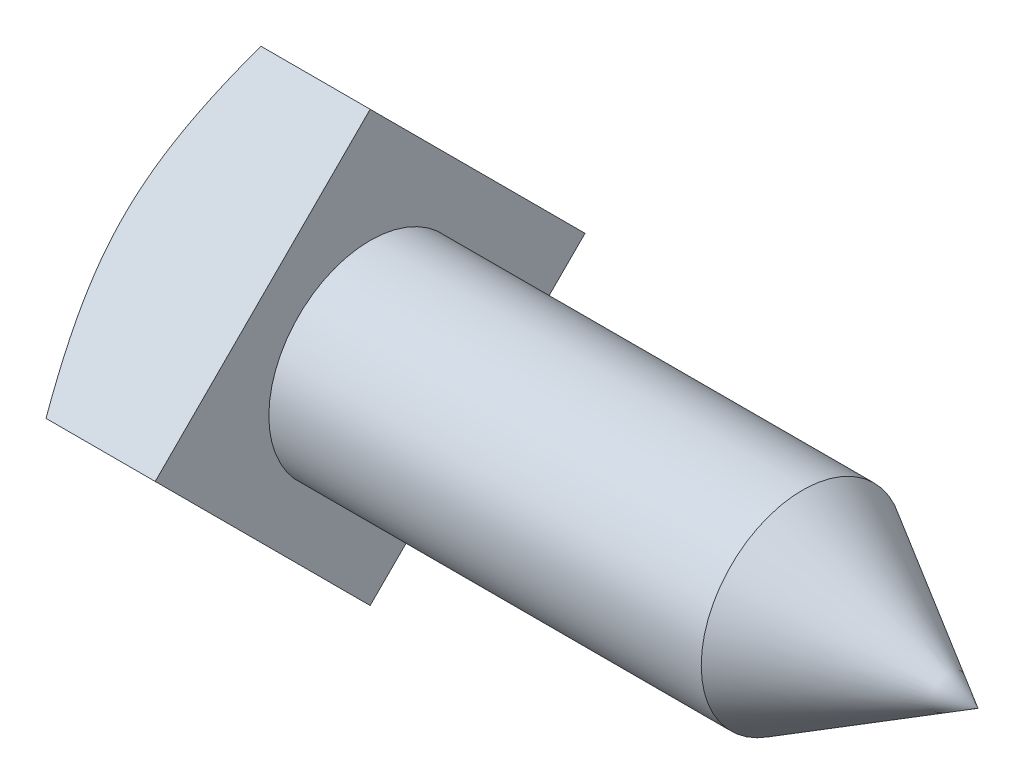
ISO-10303-21;
HEADER;
FILE_DESCRIPTION(('STEP AP214'),'2;1');
FILE_NAME('part.step','',(''),(''),'','','');
FILE_SCHEMA(('AUTOMOTIVE_DESIGN { 1 0 10303 214 1 1 1 1 }'));
ENDSEC;
DATA;
#1=APPLICATION_CONTEXT('core data for automotive mechanical design processes');
#2=APPLICATION_PROTOCOL_DEFINITION('international standard','automotive_design',2000,#1);
#3=PRODUCT_CONTEXT('',#1,'mechanical');
#4=PRODUCT('Part','Part','',(#3));
#5=PRODUCT_RELATED_PRODUCT_CATEGORY('part','',(#4));
#6=PRODUCT_DEFINITION_FORMATION('','',#4);
#7=PRODUCT_DEFINITION_CONTEXT('part definition',#1,'design');
#8=PRODUCT_DEFINITION('design','',#6,#7);
#9=PRODUCT_DEFINITION_SHAPE('','',#8);
#10=(LENGTH_UNIT() NAMED_UNIT(*) SI_UNIT(.MILLI.,.METRE.));
#11=(NAMED_UNIT(*) PLANE_ANGLE_UNIT() SI_UNIT($,.RADIAN.));
#12=(NAMED_UNIT(*) SI_UNIT($,.STERADIAN.) SOLID_ANGLE_UNIT());
#13=UNCERTAINTY_MEASURE_WITH_UNIT(LENGTH_MEASURE(1.E-05),#10,'distance_accuracy_value','');
#14=(GEOMETRIC_REPRESENTATION_CONTEXT(3) GLOBAL_UNCERTAINTY_ASSIGNED_CONTEXT((#13)) GLOBAL_UNIT_ASSIGNED_CONTEXT((#10,
#11,#12)) REPRESENTATION_CONTEXT('',''));
#15=CARTESIAN_POINT('',(0.,0.,0.));
#16=DIRECTION('',(0.,0.,1.));
#17=DIRECTION('',(1.,0.,0.));
#18=AXIS2_PLACEMENT_3D('',#15,#16,#17);
#19=CARTESIAN_POINT('',(17.3736,0.,-26.9407683632075));
#20=DIRECTION('',(0.,-0.707106781186549,0.707106781186546));
#21=DIRECTION('',(0.,-0.707106781186546,-0.707106781186549));
#22=AXIS2_PLACEMENT_3D('',#19,#20,#21);
#23=PLANE('',#22);
#24=CARTESIAN_POINT('',(3.67961897836863,26.9409683632075,0.000200000000045216));
#25=CARTESIAN_POINT('',(3.5548106744779,26.6733023350022,-0.267466028205203));
#26=CARTESIAN_POINT('',(3.43166591489863,26.4052457385589,-0.535522624648477));
#27=CARTESIAN_POINT('',(3.1890899267751,25.8682845755296,-1.0724837876778));
#28=CARTESIAN_POINT('',(3.06965881940346,25.5993799815889,-1.34138838161848));
#29=CARTESIAN_POINT('',(2.83485734138483,25.0605646045843,-1.88020375862312));
#30=CARTESIAN_POINT('',(2.71948863089288,24.7906534588859,-2.15011490432156));
#31=CARTESIAN_POINT('',(2.49331484279292,24.2498808259797,-2.69088753722775));
#32=CARTESIAN_POINT('',(2.38250972891658,23.9790193463431,-2.96174901686432));
#33=CARTESIAN_POINT('',(2.05612530796253,23.1610744333138,-3.77969392989365));
#34=CARTESIAN_POINT('',(1.84824930439006,22.6124346923039,-4.32833367090352));
#35=CARTESIAN_POINT('',(1.45758123264963,21.5107337556084,-5.430034607599));
#36=CARTESIAN_POINT('',(1.27478662714833,20.9576730131681,-5.9830953500393));
#37=CARTESIAN_POINT('',(0.945511734071481,19.8664326312515,-7.07433573195595));
#38=CARTESIAN_POINT('',(0.79798088957727,19.3284131944761,-7.61235516873135));
#39=CARTESIAN_POINT('',(0.536422228800219,18.2482773891681,-8.69249097403933));
#40=CARTESIAN_POINT('',(0.422394171895823,17.7061610500887,-9.23460731311871));
#41=CARTESIAN_POINT('',(0.233146716482555,16.6203771657464,-10.3203911974611));
#42=CARTESIAN_POINT('',(0.157794101744971,16.0767215200036,-10.8640468432038));
#43=CARTESIAN_POINT('',(0.0762638360765365,15.2597076194693,-11.6810607437382));
#44=CARTESIAN_POINT('',(0.0543365936512322,14.9871029257431,-11.9536654374643));
#45=CARTESIAN_POINT('',(0.0212582185382671,14.4415698757762,-12.4991984874312));
#46=CARTESIAN_POINT('',(0.0101066830280692,14.1686415320162,-12.7721268311912));
#47=CARTESIAN_POINT('',(-0.00161011344190508,13.605599139522,-13.3351692236855));
#48=CARTESIAN_POINT('',(-0.00146976557287539,13.3154776845977,-13.6252906786097));
#49=CARTESIAN_POINT('',(0.011159967421425,12.7353688974673,-14.2053994657402));
#50=CARTESIAN_POINT('',(0.0236494175099609,12.4453815659747,-14.4953867972328));
#51=CARTESIAN_POINT('',(0.0607802459783497,11.8657903885889,-15.0749779746185));
#52=CARTESIAN_POINT('',(0.0854218766143621,11.5761865507815,-15.364581812426));
#53=CARTESIAN_POINT('',(0.146470352139668,10.9975953278747,-15.9431730353328));
#54=CARTESIAN_POINT('',(0.182877743644435,10.7086079720439,-16.2321603911635));
#55=CARTESIAN_POINT('',(0.309293308607137,9.84074831588848,-17.100020047319));
#56=CARTESIAN_POINT('',(0.416353313854458,9.26308735289191,-17.6776810103156));
#57=CARTESIAN_POINT('',(0.670258795524519,8.11225138699092,-18.8285169762166));
#58=CARTESIAN_POINT('',(0.81710493512163,7.53907645902574,-19.4016919041817));
#59=CARTESIAN_POINT('',(1.15063001194142,6.37560138249195,-20.5651669807155));
#60=CARTESIAN_POINT('',(1.33862518399708,5.78549181858159,-21.1552765446259));
#61=CARTESIAN_POINT('',(1.74416737172929,4.61034109547358,-22.3304272677339));
#62=CARTESIAN_POINT('',(1.96171822054831,4.0253006041821,-22.9154677590254));
#63=CARTESIAN_POINT('',(2.30502412485186,3.15351567590044,-23.7872526873071));
#64=CARTESIAN_POINT('',(2.42180887555157,2.86498021977967,-24.0757881434278));
#65=CARTESIAN_POINT('',(2.66065189048929,2.28899759935433,-24.6517707638532));
#66=CARTESIAN_POINT('',(2.78271020630349,2.00155044572342,-24.9392179174841));
#67=CARTESIAN_POINT('',(3.03148171467405,1.42782962681058,-25.5129387363969));
#68=CARTESIAN_POINT('',(3.15819248210805,1.14155543424872,-25.7992129289588));
#69=CARTESIAN_POINT('',(3.41584794221307,0.569973412950501,-26.370794950257));
#70=CARTESIAN_POINT('',(3.54679246370201,0.284665545657028,-26.6561028175505));
#71=CARTESIAN_POINT('',(3.67961897836863,-0.000199999999958303,-26.9409683632075));
#72=B_SPLINE_CURVE_WITH_KNOTS('',3,(#24,#25,#26,#27,#28,#29,#30,#31,#32,#33,#34,#35,#36,#37,#38,
#39,#40,#41,#42,#43,#44,#45,#46,#47,#48,#49,#50,#51,#52,#53,#54,#55,#56,#57,#58,#59,#60,#61,#62,
#63,#64,#65,#66,#67,#68,#69,#70,#71),.UNSPECIFIED.,.F.,.F.,(4,2,2,2,2,2,2,2,2,2,2,2,2,2,2,2,2,2,
2,2,2,2,2,4),(0.,1.19574621782804,2.39153141076051,3.5877997366759,4.78405855363789,
7.1934730092088,9.60264353889679,11.9271362943406,14.2516123545547,16.5680271795087,
17.726333362957,18.8845962443842,20.1152898057051,21.3459898412049,22.5767154247725,
23.8074981937946,26.2780083205153,28.7485596294176,31.3142561631337,33.8802857660488,
35.1535601561366,36.4268470018451,37.6994793066262,38.9720602196475),.UNSPECIFIED.);
#73=CARTESIAN_POINT('',(3.67952571649083,26.9407683632075,0.));
#74=VERTEX_POINT('',#73);
#75=CARTESIAN_POINT('',(0.,13.4703841816038,-13.4703841816037));
#76=VERTEX_POINT('',#75);
#77=EDGE_CURVE('E104',#74,#76,#72,.T.);
#78=ORIENTED_EDGE('',*,*,#77,.F.);
#79=DIRECTION('',(-1.,0.,0.));
#80=VECTOR('',#79,1.);
#81=CARTESIAN_POINT('',(17.3736,26.9407683632075,0.));
#82=LINE('',#81,#80);
#83=CARTESIAN_POINT('',(17.3736,26.9407683632075,0.));
#84=VERTEX_POINT('',#83);
#85=EDGE_CURVE('E114',#84,#74,#82,.T.);
#86=ORIENTED_EDGE('',*,*,#85,.F.);
#87=DIRECTION('',(0.,0.707106781186546,0.707106781186549));
#88=VECTOR('',#87,1.);
#89=CARTESIAN_POINT('',(17.3736,0.,-26.9407683632075));
#90=LINE('',#89,#88);
#91=CARTESIAN_POINT('',(17.3736,0.,-26.9407683632075));
#92=VERTEX_POINT('',#91);
#93=EDGE_CURVE('E117',#92,#84,#90,.T.);
#94=ORIENTED_EDGE('',*,*,#93,.F.);
#95=DIRECTION('',(-1.,0.,0.));
#96=VECTOR('',#95,1.);
#97=CARTESIAN_POINT('',(17.3736,0.,-26.9407683632075));
#98=LINE('',#97,#96);
#99=CARTESIAN_POINT('',(3.67952571649083,0.,-26.9407683632075));
#100=VERTEX_POINT('',#99);
#101=EDGE_CURVE('E180',#92,#100,#98,.T.);
#102=ORIENTED_EDGE('',*,*,#101,.T.);
#103=EDGE_CURVE('E53',#76,#100,#72,.T.);
#104=ORIENTED_EDGE('',*,*,#103,.F.);
#105=EDGE_LOOP('',(#78,#86,#94,#102,#104));
#106=FACE_BOUND('',#105,.T.);
#107=ADVANCED_FACE('F32',(#106),#23,.F.);
#108=CARTESIAN_POINT('',(17.3736,0.,26.9407683632075));
#109=DIRECTION('',(0.,0.707106781186546,0.707106781186549));
#110=DIRECTION('',(0.,-0.707106781186549,0.707106781186546));
#111=AXIS2_PLACEMENT_3D('',#108,#109,#110);
#112=PLANE('',#111);
#113=ORIENTED_EDGE('',*,*,#85,.T.);
#114=CARTESIAN_POINT('',(3.67961897836863,26.9409683632075,-0.000199999999958046));
#115=CARTESIAN_POINT('',(3.5548106744779,26.6733023350022,0.267466028205296));
#116=CARTESIAN_POINT('',(3.43166591489863,26.4052457385589,0.535522624648567));
#117=CARTESIAN_POINT('',(3.1890899267751,25.8682845755296,1.07248378767788));
#118=CARTESIAN_POINT('',(3.06965881940345,25.5993799815889,1.34138838161855));
#119=CARTESIAN_POINT('',(2.83485734138483,25.0605646045843,1.8802037586232));
#120=CARTESIAN_POINT('',(2.71948863089288,24.7906534588859,2.15011490432164));
#121=CARTESIAN_POINT('',(2.49331484279293,24.2498808259797,2.69088753722783));
#122=CARTESIAN_POINT('',(2.38250972891658,23.9790193463431,2.9617490168644));
#123=CARTESIAN_POINT('',(2.05612530796252,23.1610744333138,3.77969392989372));
#124=CARTESIAN_POINT('',(1.84824930439005,22.6124346923039,4.3283336709036));
#125=CARTESIAN_POINT('',(1.45758123264963,21.5107337556084,5.43003460759907));
#126=CARTESIAN_POINT('',(1.27478662714833,20.9576730131681,5.98309535003937));
#127=CARTESIAN_POINT('',(0.945511734071483,19.8664326312515,7.07433573195601));
#128=CARTESIAN_POINT('',(0.797980889577271,19.3284131944761,7.61235516873141));
#129=CARTESIAN_POINT('',(0.536422228800219,18.2482773891681,8.69249097403939));
#130=CARTESIAN_POINT('',(0.422394171895823,17.7061610500887,9.23460731311877));
#131=CARTESIAN_POINT('',(0.233146716482557,16.6203771657463,10.3203911974611));
#132=CARTESIAN_POINT('',(0.157794101744973,16.0767215200036,10.8640468432039));
#133=CARTESIAN_POINT('',(0.0762638360765367,15.2597076194692,11.6810607437382));
#134=CARTESIAN_POINT('',(0.0543365936512313,14.9871029257431,11.9536654374644));
#135=CARTESIAN_POINT('',(0.0212582185382664,14.4415698757762,12.4991984874313));
#136=CARTESIAN_POINT('',(0.0101066830280697,14.1686415320162,12.7721268311913));
#137=CARTESIAN_POINT('',(-0.00161011344190393,13.6055991395219,13.3351692236856));
#138=CARTESIAN_POINT('',(-0.00146976557287488,13.3154776845977,13.6252906786098));
#139=CARTESIAN_POINT('',(0.0111599674214245,12.7353688974672,14.2053994657402));
#140=CARTESIAN_POINT('',(0.02364941750996,12.4453815659746,14.4953867972328));
#141=CARTESIAN_POINT('',(0.0607802459783491,11.8657903885889,15.0749779746186));
#142=CARTESIAN_POINT('',(0.0854218766143621,11.5761865507815,15.364581812426));
#143=CARTESIAN_POINT('',(0.146470352139668,10.9975953278746,15.9431730353328));
#144=CARTESIAN_POINT('',(0.182877743644435,10.7086079720439,16.2321603911636));
#145=CARTESIAN_POINT('',(0.309293308607135,9.84074831588842,17.100020047319));
#146=CARTESIAN_POINT('',(0.416353313854456,9.26308735289185,17.6776810103156));
#147=CARTESIAN_POINT('',(0.670258795524518,8.11225138699086,18.8285169762166));
#148=CARTESIAN_POINT('',(0.81710493512163,7.53907645902568,19.4016919041818));
#149=CARTESIAN_POINT('',(1.15063001194141,6.37560138249188,20.5651669807155));
#150=CARTESIAN_POINT('',(1.33862518399708,5.78549181858152,21.1552765446259));
#151=CARTESIAN_POINT('',(1.74416737172928,4.61034109547351,22.3304272677339));
#152=CARTESIAN_POINT('',(1.96171822054831,4.02530060418203,22.9154677590254));
#153=CARTESIAN_POINT('',(2.30502412485186,3.15351567590037,23.7872526873071));
#154=CARTESIAN_POINT('',(2.42180887555157,2.86498021977959,24.0757881434278));
#155=CARTESIAN_POINT('',(2.66065189048929,2.28899759935425,24.6517707638532));
#156=CARTESIAN_POINT('',(2.78271020630349,2.00155044572334,24.9392179174841));
#157=CARTESIAN_POINT('',(3.03148171467405,1.42782962681049,25.5129387363969));
#158=CARTESIAN_POINT('',(3.15819248210805,1.14155543424863,25.7992129289588));
#159=CARTESIAN_POINT('',(3.41584794221307,0.569973412950413,26.370794950257));
#160=CARTESIAN_POINT('',(3.54679246370201,0.284665545656939,26.6561028175505));
#161=CARTESIAN_POINT('',(3.67961897836863,-0.0002000000000479,26.9409683632075));
#162=B_SPLINE_CURVE_WITH_KNOTS('',3,(#114,#115,#116,#117,#118,#119,#120,#121,#122,#123,#124,
#125,#126,#127,#128,#129,#130,#131,#132,#133,#134,#135,#136,#137,#138,#139,#140,#141,#142,#143,
#144,#145,#146,#147,#148,#149,#150,#151,#152,#153,#154,#155,#156,#157,#158,#159,#160,#161),
.UNSPECIFIED.,.F.,.F.,(4,2,2,2,2,2,2,2,2,2,2,2,2,2,2,2,2,2,2,2,2,2,2,4),(0.,1.19574621782803,
2.39153141076051,3.5877997366759,4.78405855363789,7.1934730092088,9.60264353889679,
11.9271362943406,14.2516123545547,16.5680271795087,17.726333362957,18.8845962443842,
20.1152898057051,21.3459898412049,22.5767154247725,23.8074981937946,26.2780083205153,
28.7485596294176,31.3142561631337,33.8802857660488,35.1535601561366,36.4268470018451,
37.6994793066262,38.9720602196475),.UNSPECIFIED.);
#163=CARTESIAN_POINT('',(0.,13.4703841816037,13.4703841816038));
#164=VERTEX_POINT('',#163);
#165=EDGE_CURVE('E97',#74,#164,#162,.T.);
#166=ORIENTED_EDGE('',*,*,#165,.T.);
#167=CARTESIAN_POINT('',(3.67952571649083,0.,26.9407683632075));
#168=VERTEX_POINT('',#167);
#169=EDGE_CURVE('E88',#164,#168,#162,.T.);
#170=ORIENTED_EDGE('',*,*,#169,.T.);
#171=DIRECTION('',(-1.,0.,0.));
#172=VECTOR('',#171,1.);
#173=CARTESIAN_POINT('',(17.3736,0.,26.9407683632075));
#174=LINE('',#173,#172);
#175=CARTESIAN_POINT('',(17.3736,0.,26.9407683632075));
#176=VERTEX_POINT('',#175);
#177=EDGE_CURVE('E187',#176,#168,#174,.T.);
#178=ORIENTED_EDGE('',*,*,#177,.F.);
#179=DIRECTION('',(0.,0.707106781186549,-0.707106781186546));
#180=VECTOR('',#179,1.);
#181=CARTESIAN_POINT('',(17.3736,0.,26.9407683632075));
#182=LINE('',#181,#180);
#183=EDGE_CURVE('E202',#176,#84,#182,.T.);
#184=ORIENTED_EDGE('',*,*,#183,.T.);
#185=EDGE_LOOP('',(#113,#166,#170,#178,#184));
#186=FACE_BOUND('',#185,.T.);
#187=ADVANCED_FACE('F111',(#186),#112,.T.);
#188=CARTESIAN_POINT('',(17.3736,0.,26.9407683632075));
#189=DIRECTION('',(0.,0.707106781186549,-0.707106781186546));
#190=DIRECTION('',(0.,0.707106781186546,0.707106781186549));
#191=AXIS2_PLACEMENT_3D('',#188,#189,#190);
#192=PLANE('',#191);
#193=CARTESIAN_POINT('',(3.67961897836863,-26.9409683632075,-0.000200000000037707));
#194=CARTESIAN_POINT('',(3.5548106744779,-26.6733023350022,0.267466028205212));
#195=CARTESIAN_POINT('',(3.43166591489863,-26.4052457385589,0.535522624648485));
#196=CARTESIAN_POINT('',(3.1890899267751,-25.8682845755296,1.07248378767781));
#197=CARTESIAN_POINT('',(3.06965881940346,-25.5993799815889,1.34138838161848));
#198=CARTESIAN_POINT('',(2.83485734138483,-25.0605646045843,1.88020375862312));
#199=CARTESIAN_POINT('',(2.71948863089288,-24.7906534588859,2.15011490432156));
#200=CARTESIAN_POINT('',(2.49331484279292,-24.2498808259797,2.69088753722775));
#201=CARTESIAN_POINT('',(2.38250972891658,-23.9790193463431,2.96174901686433));
#202=CARTESIAN_POINT('',(2.05612530796253,-23.1610744333138,3.77969392989365));
#203=CARTESIAN_POINT('',(1.84824930439006,-22.6124346923039,4.32833367090353));
#204=CARTESIAN_POINT('',(1.45758123264964,-21.5107337556084,5.430034607599));
#205=CARTESIAN_POINT('',(1.27478662714834,-20.9576730131681,5.98309535003931));
#206=CARTESIAN_POINT('',(0.945511734071484,-19.8664326312515,7.07433573195595));
#207=CARTESIAN_POINT('',(0.797980889577274,-19.3284131944761,7.61235516873135));
#208=CARTESIAN_POINT('',(0.536422228800222,-18.2482773891681,8.69249097403933));
#209=CARTESIAN_POINT('',(0.422394171895826,-17.7061610500887,9.23460731311871));
#210=CARTESIAN_POINT('',(0.233146716482558,-16.6203771657464,10.3203911974611));
#211=CARTESIAN_POINT('',(0.157794101744974,-16.0767215200036,10.8640468432038));
#212=CARTESIAN_POINT('',(0.0762638360765389,-15.2597076194693,11.6810607437382));
#213=CARTESIAN_POINT('',(0.0543365936512346,-14.9871029257431,11.9536654374643));
#214=CARTESIAN_POINT('',(0.0212582185382695,-14.4415698757762,12.4991984874312));
#215=CARTESIAN_POINT('',(0.0101066830280716,-14.1686415320162,12.7721268311912));
#216=CARTESIAN_POINT('',(-0.0016101134419026,-13.605599139522,13.3351692236855));
#217=CARTESIAN_POINT('',(-0.00146976557287277,-13.3154776845977,13.6252906786097));
#218=CARTESIAN_POINT('',(0.0111599674214272,-12.7353688974673,14.2053994657402));
#219=CARTESIAN_POINT('',(0.0236494175099626,-12.4453815659747,14.4953867972328));
#220=CARTESIAN_POINT('',(0.0607802459783512,-11.8657903885889,15.0749779746185));
#221=CARTESIAN_POINT('',(0.0854218766143637,-11.5761865507815,15.364581812426));
#222=CARTESIAN_POINT('',(0.146470352139669,-10.9975953278747,15.9431730353328));
#223=CARTESIAN_POINT('',(0.182877743644437,-10.7086079720439,16.2321603911635));
#224=CARTESIAN_POINT('',(0.309293308607138,-9.84074831588848,17.100020047319));
#225=CARTESIAN_POINT('',(0.416353313854458,-9.26308735289192,17.6776810103156));
#226=CARTESIAN_POINT('',(0.670258795524519,-8.11225138699093,18.8285169762166));
#227=CARTESIAN_POINT('',(0.817104935121631,-7.53907645902575,19.4016919041817));
#228=CARTESIAN_POINT('',(1.15063001194142,-6.37560138249196,20.5651669807155));
#229=CARTESIAN_POINT('',(1.33862518399708,-5.7854918185816,21.1552765446259));
#230=CARTESIAN_POINT('',(1.74416737172929,-4.61034109547359,22.3304272677339));
#231=CARTESIAN_POINT('',(1.96171822054831,-4.02530060418211,22.9154677590254));
#232=CARTESIAN_POINT('',(2.30502412485186,-3.15351567590045,23.787252687307));
#233=CARTESIAN_POINT('',(2.42180887555157,-2.86498021977968,24.0757881434278));
#234=CARTESIAN_POINT('',(2.66065189048929,-2.28899759935433,24.6517707638532));
#235=CARTESIAN_POINT('',(2.78271020630349,-2.00155044572343,24.9392179174841));
#236=CARTESIAN_POINT('',(3.03148171467405,-1.42782962681058,25.5129387363969));
#237=CARTESIAN_POINT('',(3.15819248210805,-1.14155543424872,25.7992129289588));
#238=CARTESIAN_POINT('',(3.41584794221307,-0.569973412950508,26.370794950257));
#239=CARTESIAN_POINT('',(3.54679246370201,-0.284665545657037,26.6561028175505));
#240=CARTESIAN_POINT('',(3.67961897836863,0.000199999999947534,26.9409683632075));
#241=B_SPLINE_CURVE_WITH_KNOTS('',3,(#193,#194,#195,#196,#197,#198,#199,#200,#201,#202,#203,
#204,#205,#206,#207,#208,#209,#210,#211,#212,#213,#214,#215,#216,#217,#218,#219,#220,#221,#222,
#223,#224,#225,#226,#227,#228,#229,#230,#231,#232,#233,#234,#235,#236,#237,#238,#239,#240),
.UNSPECIFIED.,.F.,.F.,(4,2,2,2,2,2,2,2,2,2,2,2,2,2,2,2,2,2,2,2,2,2,2,4),(0.,1.19574621782803,
2.39153141076051,3.5877997366759,4.78405855363788,7.1934730092088,9.60264353889679,
11.9271362943406,14.2516123545547,16.5680271795087,17.726333362957,18.8845962443842,
20.1152898057051,21.3459898412049,22.5767154247725,23.8074981937946,26.2780083205153,
28.7485596294175,31.3142561631337,33.8802857660488,35.1535601561366,36.4268470018451,
37.6994793066262,38.9720602196474),.UNSPECIFIED.);
#242=CARTESIAN_POINT('',(3.67952571649083,-26.9407683632075,0.));
#243=VERTEX_POINT('',#242);
#244=CARTESIAN_POINT('',(0.,-13.4703841816038,13.4703841816037));
#245=VERTEX_POINT('',#244);
#246=EDGE_CURVE('E145',#243,#245,#241,.T.);
#247=ORIENTED_EDGE('',*,*,#246,.F.);
#248=DIRECTION('',(-1.,0.,0.));
#249=VECTOR('',#248,1.);
#250=CARTESIAN_POINT('',(17.3736,-26.9407683632075,0.));
#251=LINE('',#250,#249);
#252=CARTESIAN_POINT('',(17.3736,-26.9407683632075,0.));
#253=VERTEX_POINT('',#252);
#254=EDGE_CURVE('E183',#253,#243,#251,.T.);
#255=ORIENTED_EDGE('',*,*,#254,.F.);
#256=DIRECTION('',(0.,-0.707106781186546,-0.707106781186549));
#257=VECTOR('',#256,1.);
#258=CARTESIAN_POINT('',(17.3736,0.,26.9407683632075));
#259=LINE('',#258,#257);
#260=EDGE_CURVE('E189',#176,#253,#259,.T.);
#261=ORIENTED_EDGE('',*,*,#260,.F.);
#262=ORIENTED_EDGE('',*,*,#177,.T.);
#263=EDGE_CURVE('E93',#245,#168,#241,.T.);
#264=ORIENTED_EDGE('',*,*,#263,.F.);
#265=EDGE_LOOP('',(#247,#255,#261,#262,#264));
#266=FACE_BOUND('',#265,.T.);
#267=ADVANCED_FACE('F150',(#266),#192,.F.);
#268=CARTESIAN_POINT('',(17.3736,0.,-26.9407683632075));
#269=DIRECTION('',(0.,-0.707106781186546,-0.707106781186549));
#270=DIRECTION('',(0.,0.707106781186549,-0.707106781186546));
#271=AXIS2_PLACEMENT_3D('',#268,#269,#270);
#272=PLANE('',#271);
#273=ORIENTED_EDGE('',*,*,#254,.T.);
#274=CARTESIAN_POINT('',(3.67961897836863,-26.9409683632075,0.000199999999957179));
#275=CARTESIAN_POINT('',(3.5548106744779,-26.6733023350022,-0.267466028205298));
#276=CARTESIAN_POINT('',(3.43166591489863,-26.4052457385589,-0.535522624648569));
#277=CARTESIAN_POINT('',(3.1890899267751,-25.8682845755296,-1.07248378767788));
#278=CARTESIAN_POINT('',(3.06965881940346,-25.5993799815889,-1.34138838161855));
#279=CARTESIAN_POINT('',(2.83485734138483,-25.0605646045843,-1.8802037586232));
#280=CARTESIAN_POINT('',(2.71948863089288,-24.7906534588859,-2.15011490432164));
#281=CARTESIAN_POINT('',(2.49331484279293,-24.2498808259797,-2.69088753722783));
#282=CARTESIAN_POINT('',(2.38250972891658,-23.9790193463431,-2.9617490168644));
#283=CARTESIAN_POINT('',(2.05612530796253,-23.1610744333138,-3.77969392989372));
#284=CARTESIAN_POINT('',(1.84824930439006,-22.6124346923039,-4.32833367090359));
#285=CARTESIAN_POINT('',(1.45758123264964,-21.5107337556084,-5.43003460759906));
#286=CARTESIAN_POINT('',(1.27478662714834,-20.9576730131681,-5.98309535003937));
#287=CARTESIAN_POINT('',(0.945511734071483,-19.8664326312515,-7.07433573195601));
#288=CARTESIAN_POINT('',(0.797980889577275,-19.3284131944761,-7.61235516873141));
#289=CARTESIAN_POINT('',(0.536422228800223,-18.2482773891681,-8.69249097403939));
#290=CARTESIAN_POINT('',(0.422394171895824,-17.7061610500887,-9.23460731311877));
#291=CARTESIAN_POINT('',(0.233146716482556,-16.6203771657463,-10.3203911974611));
#292=CARTESIAN_POINT('',(0.157794101744973,-16.0767215200036,-10.8640468432039));
#293=CARTESIAN_POINT('',(0.076263836076538,-15.2597076194692,-11.6810607437382));
#294=CARTESIAN_POINT('',(0.054336593651233,-14.9871029257431,-11.9536654374644));
#295=CARTESIAN_POINT('',(0.0212582185382679,-14.4415698757762,-12.4991984874313));
#296=CARTESIAN_POINT('',(0.0101066830280708,-14.1686415320162,-12.7721268311913));
#297=CARTESIAN_POINT('',(-0.00161011344190344,-13.6055991395219,-13.3351692236855));
#298=CARTESIAN_POINT('',(-0.00146976557287458,-13.3154776845977,-13.6252906786098));
#299=CARTESIAN_POINT('',(0.0111599674214242,-12.7353688974672,-14.2053994657402));
#300=CARTESIAN_POINT('',(0.0236494175099593,-12.4453815659746,-14.4953867972328));
#301=CARTESIAN_POINT('',(0.0607802459783481,-11.8657903885889,-15.0749779746186));
#302=CARTESIAN_POINT('',(0.0854218766143613,-11.5761865507815,-15.364581812426));
#303=CARTESIAN_POINT('',(0.146470352139667,-10.9975953278747,-15.9431730353328));
#304=CARTESIAN_POINT('',(0.182877743644434,-10.7086079720439,-16.2321603911636));
#305=CARTESIAN_POINT('',(0.309293308607134,-9.84074831588843,-17.100020047319));
#306=CARTESIAN_POINT('',(0.416353313854455,-9.26308735289186,-17.6776810103156));
#307=CARTESIAN_POINT('',(0.670258795524518,-8.11225138699086,-18.8285169762166));
#308=CARTESIAN_POINT('',(0.81710493512163,-7.53907645902569,-19.4016919041818));
#309=CARTESIAN_POINT('',(1.15063001194142,-6.37560138249189,-20.5651669807155));
#310=CARTESIAN_POINT('',(1.33862518399708,-5.78549181858152,-21.1552765446259));
#311=CARTESIAN_POINT('',(1.74416737172929,-4.61034109547351,-22.3304272677339));
#312=CARTESIAN_POINT('',(1.96171822054831,-4.02530060418203,-22.9154677590254));
#313=CARTESIAN_POINT('',(2.30502412485186,-3.15351567590037,-23.7872526873071));
#314=CARTESIAN_POINT('',(2.42180887555157,-2.86498021977959,-24.0757881434278));
#315=CARTESIAN_POINT('',(2.66065189048929,-2.28899759935425,-24.6517707638532));
#316=CARTESIAN_POINT('',(2.78271020630349,-2.00155044572334,-24.9392179174841));
#317=CARTESIAN_POINT('',(3.03148171467406,-1.42782962681049,-25.5129387363969));
#318=CARTESIAN_POINT('',(3.15819248210805,-1.14155543424863,-25.7992129289588));
#319=CARTESIAN_POINT('',(3.41584794221307,-0.569973412950415,-26.370794950257));
#320=CARTESIAN_POINT('',(3.54679246370201,-0.284665545656943,-26.6561028175505));
#321=CARTESIAN_POINT('',(3.67961897836863,0.00020000000004155,-26.9409683632075));
#322=B_SPLINE_CURVE_WITH_KNOTS('',3,(#274,#275,#276,#277,#278,#279,#280,#281,#282,#283,#284,
#285,#286,#287,#288,#289,#290,#291,#292,#293,#294,#295,#296,#297,#298,#299,#300,#301,#302,#303,
#304,#305,#306,#307,#308,#309,#310,#311,#312,#313,#314,#315,#316,#317,#318,#319,#320,#321),
.UNSPECIFIED.,.F.,.F.,(4,2,2,2,2,2,2,2,2,2,2,2,2,2,2,2,2,2,2,2,2,2,2,4),(0.,1.19574621782803,
2.39153141076051,3.58779973667589,4.78405855363788,7.19347300920879,9.60264353889679,
11.9271362943406,14.2516123545547,16.5680271795087,17.726333362957,18.8845962443842,
20.1152898057051,21.3459898412049,22.5767154247725,23.8074981937946,26.2780083205153,
28.7485596294176,31.3142561631337,33.8802857660488,35.1535601561366,36.4268470018451,
37.6994793066262,38.9720602196475),.UNSPECIFIED.);
#323=CARTESIAN_POINT('',(0.,-13.4703841816037,-13.4703841816038));
#324=VERTEX_POINT('',#323);
#325=EDGE_CURVE('E149',#243,#324,#322,.T.);
#326=ORIENTED_EDGE('',*,*,#325,.T.);
#327=EDGE_CURVE('E107',#324,#100,#322,.T.);
#328=ORIENTED_EDGE('',*,*,#327,.T.);
#329=ORIENTED_EDGE('',*,*,#101,.F.);
#330=DIRECTION('',(0.,-0.707106781186549,0.707106781186547));
#331=VECTOR('',#330,1.);
#332=CARTESIAN_POINT('',(17.3736,0.,-26.9407683632075));
#333=LINE('',#332,#331);
#334=EDGE_CURVE('E184',#92,#253,#333,.T.);
#335=ORIENTED_EDGE('',*,*,#334,.T.);
#336=EDGE_LOOP('',(#273,#326,#328,#329,#335));
#337=FACE_BOUND('',#336,.T.);
#338=ADVANCED_FACE('F153',(#337),#272,.T.);
#339=CARTESIAN_POINT('',(17.3736,0.,-26.9407683632075));
#340=DIRECTION('',(1.,0.,0.));
#341=DIRECTION('',(0.,0.,-1.));
#342=AXIS2_PLACEMENT_3D('',#339,#340,#341);
#343=PLANE('',#342);
#344=CARTESIAN_POINT('',(17.3736,0.,0.));
#345=DIRECTION('',(1.,0.,0.));
#346=DIRECTION('',(0.,0.,-1.));
#347=AXIS2_PLACEMENT_3D('',#344,#345,#346);
#348=CIRCLE('',#347,12.7);
#349=CARTESIAN_POINT('',(17.3736,0.,-12.7));
#350=VERTEX_POINT('',#349);
#351=EDGE_CURVE('E194',#350,#350,#348,.T.);
#352=ORIENTED_EDGE('',*,*,#351,.F.);
#353=EDGE_LOOP('',(#352));
#354=FACE_BOUND('',#353,.T.);
#355=ORIENTED_EDGE('',*,*,#93,.T.);
#356=ORIENTED_EDGE('',*,*,#183,.F.);
#357=ORIENTED_EDGE('',*,*,#260,.T.);
#358=ORIENTED_EDGE('',*,*,#334,.F.);
#359=EDGE_LOOP('',(#355,#356,#357,#358));
#360=FACE_BOUND('',#359,.T.);
#361=ADVANCED_FACE('F158',(#354,#360),#343,.T.);
#362=CARTESIAN_POINT('',(0.,0.,0.));
#363=DIRECTION('',(-1.,0.,0.));
#364=DIRECTION('',(0.,0.,1.));
#365=AXIS2_PLACEMENT_3D('',#362,#363,#364);
#366=CYLINDRICAL_SURFACE('',#365,12.7);
#367=CARTESIAN_POINT('',(71.5765547438753,0.,0.));
#368=DIRECTION('',(-1.,0.,0.));
#369=DIRECTION('',(0.,0.,1.));
#370=AXIS2_PLACEMENT_3D('',#367,#368,#369);
#371=CIRCLE('',#370,12.7);
#372=CARTESIAN_POINT('',(71.5765547438753,0.,12.7));
#373=VERTEX_POINT('',#372);
#374=EDGE_CURVE('E115',#373,#373,#371,.T.);
#375=ORIENTED_EDGE('',*,*,#374,.T.);
#376=EDGE_LOOP('',(#375));
#377=FACE_BOUND('',#376,.T.);
#378=ORIENTED_EDGE('',*,*,#351,.T.);
#379=EDGE_LOOP('',(#378));
#380=FACE_BOUND('',#379,.T.);
#381=ADVANCED_FACE('F163',(#377,#380),#366,.T.);
#382=CARTESIAN_POINT('',(71.5765547438753,0.,0.));
#383=DIRECTION('',(-1.,0.,0.));
#384=DIRECTION('',(0.,0.,1.));
#385=AXIS2_PLACEMENT_3D('',#382,#383,#384);
#386=CONICAL_SURFACE('',#385,12.7,0.5235987755983);
#387=CARTESIAN_POINT('',(93.5736,0.,0.));
#388=VERTEX_POINT('',#387);
#389=VERTEX_LOOP('',#388);
#390=FACE_BOUND('',#389,.T.);
#391=ORIENTED_EDGE('',*,*,#374,.F.);
#392=EDGE_LOOP('',(#391));
#393=FACE_BOUND('',#392,.T.);
#394=ADVANCED_FACE('F135',(#390,#393),#386,.T.);
#395=CARTESIAN_POINT('',(0.,0.,0.));
#396=DIRECTION('',(1.,0.,0.));
#397=DIRECTION('',(0.,0.,-1.));
#398=AXIS2_PLACEMENT_3D('',#395,#396,#397);
#399=CONICAL_SURFACE('',#398,19.05,1.13446401379631);
#400=ORIENTED_EDGE('',*,*,#103,.T.);
#401=ORIENTED_EDGE('',*,*,#327,.F.);
#402=CARTESIAN_POINT('',(0.,0.,0.));
#403=DIRECTION('',(1.,0.,0.));
#404=DIRECTION('',(0.,0.,-1.));
#405=AXIS2_PLACEMENT_3D('',#402,#403,#404);
#406=CIRCLE('',#405,19.05);
#407=EDGE_CURVE('E36',#76,#324,#406,.F.);
#408=ORIENTED_EDGE('',*,*,#407,.F.);
#409=EDGE_LOOP('',(#400,#401,#408));
#410=FACE_BOUND('',#409,.T.);
#411=ADVANCED_FACE('F170',(#410),#399,.T.);
#412=ORIENTED_EDGE('',*,*,#77,.T.);
#413=CARTESIAN_POINT('',(0.,0.,0.));
#414=DIRECTION('',(-1.,0.,0.));
#415=DIRECTION('',(0.,0.,1.));
#416=AXIS2_PLACEMENT_3D('',#413,#414,#415);
#417=CIRCLE('',#416,19.05);
#418=EDGE_CURVE('E101',#164,#76,#417,.T.);
#419=ORIENTED_EDGE('',*,*,#418,.F.);
#420=ORIENTED_EDGE('',*,*,#165,.F.);
#421=EDGE_LOOP('',(#412,#419,#420));
#422=FACE_BOUND('',#421,.T.);
#423=ADVANCED_FACE('F102',(#422),#399,.T.);
#424=EDGE_CURVE('E41',#245,#164,#406,.F.);
#425=ORIENTED_EDGE('',*,*,#424,.F.);
#426=ORIENTED_EDGE('',*,*,#263,.T.);
#427=ORIENTED_EDGE('',*,*,#169,.F.);
#428=EDGE_LOOP('',(#425,#426,#427));
#429=FACE_BOUND('',#428,.T.);
#430=ADVANCED_FACE('F90',(#429),#399,.T.);
#431=ORIENTED_EDGE('',*,*,#246,.T.);
#432=EDGE_CURVE('E11',#324,#245,#406,.F.);
#433=ORIENTED_EDGE('',*,*,#432,.F.);
#434=ORIENTED_EDGE('',*,*,#325,.F.);
#435=EDGE_LOOP('',(#431,#433,#434));
#436=FACE_BOUND('',#435,.T.);
#437=ADVANCED_FACE('F134',(#436),#399,.T.);
#438=CARTESIAN_POINT('',(0.,0.,-26.9407683632075));
#439=DIRECTION('',(1.,0.,0.));
#440=DIRECTION('',(0.,0.,-1.));
#441=AXIS2_PLACEMENT_3D('',#438,#439,#440);
#442=PLANE('',#441);
#443=ORIENTED_EDGE('',*,*,#407,.T.);
#444=ORIENTED_EDGE('',*,*,#432,.T.);
#445=ORIENTED_EDGE('',*,*,#424,.T.);
#446=ORIENTED_EDGE('',*,*,#418,.T.);
#447=EDGE_LOOP('',(#443,#444,#445,#446));
#448=FACE_BOUND('',#447,.T.);
#449=ADVANCED_FACE('F109',(#448),#442,.F.);
#450=CLOSED_SHELL('',(#107,#187,#267,#338,#361,#381,#394,#411,#423,#430,#437,#449));
#451=MANIFOLD_SOLID_BREP('B2',#450);
#452=ADVANCED_BREP_SHAPE_REPRESENTATION('',(#18,#451),#14);
#453=SHAPE_DEFINITION_REPRESENTATION(#9,#452);
ENDSEC;
END-ISO-10303-21;
